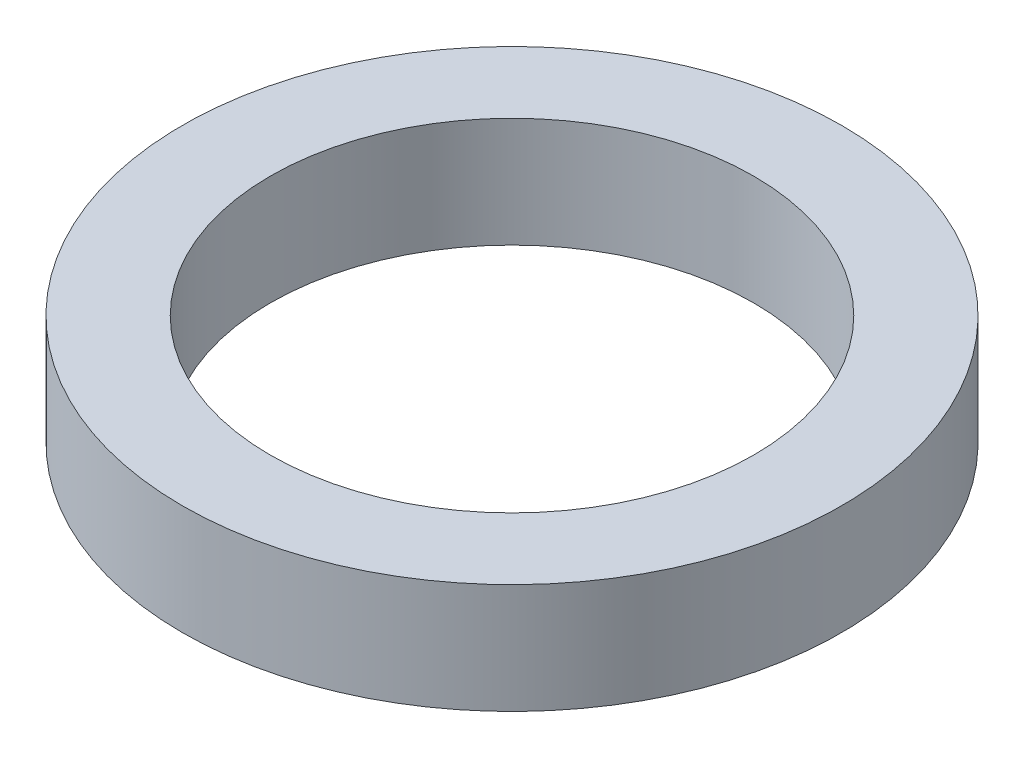
ISO-10303-21;
HEADER;
FILE_DESCRIPTION(('STEP AP214'),'2;1');
FILE_NAME('part.step','',(''),(''),'','','');
FILE_SCHEMA(('AUTOMOTIVE_DESIGN { 1 0 10303 214 1 1 1 1 }'));
ENDSEC;
DATA;
#1=APPLICATION_CONTEXT('core data for automotive mechanical design processes');
#2=APPLICATION_PROTOCOL_DEFINITION('international standard','automotive_design',2000,#1);
#3=PRODUCT_CONTEXT('',#1,'mechanical');
#4=PRODUCT('Part','Part','',(#3));
#5=PRODUCT_RELATED_PRODUCT_CATEGORY('part','',(#4));
#6=PRODUCT_DEFINITION_FORMATION('','',#4);
#7=PRODUCT_DEFINITION_CONTEXT('part definition',#1,'design');
#8=PRODUCT_DEFINITION('design','',#6,#7);
#9=PRODUCT_DEFINITION_SHAPE('','',#8);
#10=(LENGTH_UNIT() NAMED_UNIT(*) SI_UNIT(.MILLI.,.METRE.));
#11=(NAMED_UNIT(*) PLANE_ANGLE_UNIT() SI_UNIT($,.RADIAN.));
#12=(NAMED_UNIT(*) SI_UNIT($,.STERADIAN.) SOLID_ANGLE_UNIT());
#13=UNCERTAINTY_MEASURE_WITH_UNIT(LENGTH_MEASURE(1.E-05),#10,'distance_accuracy_value','');
#14=(GEOMETRIC_REPRESENTATION_CONTEXT(3) GLOBAL_UNCERTAINTY_ASSIGNED_CONTEXT((#13)) GLOBAL_UNIT_ASSIGNED_CONTEXT((#10,
#11,#12)) REPRESENTATION_CONTEXT('',''));
#15=CARTESIAN_POINT('',(0.,0.,0.));
#16=DIRECTION('',(0.,0.,1.));
#17=DIRECTION('',(1.,0.,0.));
#18=AXIS2_PLACEMENT_3D('',#15,#16,#17);
#19=CARTESIAN_POINT('',(0.,5.,0.));
#20=DIRECTION('',(0.,1.,0.));
#21=DIRECTION('',(0.,0.,1.));
#22=AXIS2_PLACEMENT_3D('',#19,#20,#21);
#23=PLANE('',#22);
#24=CARTESIAN_POINT('',(0.,5.,0.));
#25=DIRECTION('',(0.,1.,0.));
#26=DIRECTION('',(0.,0.,1.));
#27=AXIS2_PLACEMENT_3D('',#24,#25,#26);
#28=CIRCLE('',#27,15.);
#29=CARTESIAN_POINT('',(0.,5.,15.));
#30=VERTEX_POINT('',#29);
#31=EDGE_CURVE('E10',#30,#30,#28,.T.);
#32=ORIENTED_EDGE('',*,*,#31,.T.);
#33=EDGE_LOOP('',(#32));
#34=FACE_BOUND('',#33,.T.);
#35=CARTESIAN_POINT('',(0.,5.,0.));
#36=DIRECTION('',(0.,1.,0.));
#37=DIRECTION('',(0.,0.,1.));
#38=AXIS2_PLACEMENT_3D('',#35,#36,#37);
#39=CIRCLE('',#38,11.);
#40=CARTESIAN_POINT('',(0.,5.,11.));
#41=VERTEX_POINT('',#40);
#42=EDGE_CURVE('E50',#41,#41,#39,.T.);
#43=ORIENTED_EDGE('',*,*,#42,.F.);
#44=EDGE_LOOP('',(#43));
#45=FACE_BOUND('',#44,.T.);
#46=ADVANCED_FACE('F39',(#34,#45),#23,.T.);
#47=CARTESIAN_POINT('',(0.,0.,0.));
#48=DIRECTION('',(0.,1.,0.));
#49=DIRECTION('',(0.,0.,1.));
#50=AXIS2_PLACEMENT_3D('',#47,#48,#49);
#51=PLANE('',#50);
#52=CARTESIAN_POINT('',(0.,0.,0.));
#53=DIRECTION('',(0.,1.,0.));
#54=DIRECTION('',(0.,0.,1.));
#55=AXIS2_PLACEMENT_3D('',#52,#53,#54);
#56=CIRCLE('',#55,15.);
#57=CARTESIAN_POINT('',(0.,0.,15.));
#58=VERTEX_POINT('',#57);
#59=EDGE_CURVE('E43',#58,#58,#56,.T.);
#60=ORIENTED_EDGE('',*,*,#59,.F.);
#61=EDGE_LOOP('',(#60));
#62=FACE_BOUND('',#61,.T.);
#63=CARTESIAN_POINT('',(0.,0.,0.));
#64=DIRECTION('',(0.,1.,0.));
#65=DIRECTION('',(0.,0.,1.));
#66=AXIS2_PLACEMENT_3D('',#63,#64,#65);
#67=CIRCLE('',#66,11.);
#68=CARTESIAN_POINT('',(0.,0.,11.));
#69=VERTEX_POINT('',#68);
#70=EDGE_CURVE('E52',#69,#69,#67,.T.);
#71=ORIENTED_EDGE('',*,*,#70,.T.);
#72=EDGE_LOOP('',(#71));
#73=FACE_BOUND('',#72,.T.);
#74=ADVANCED_FACE('F62',(#62,#73),#51,.F.);
#75=CARTESIAN_POINT('',(0.,5.,0.));
#76=DIRECTION('',(0.,-1.,0.));
#77=DIRECTION('',(0.,0.,-1.));
#78=AXIS2_PLACEMENT_3D('',#75,#76,#77);
#79=CYLINDRICAL_SURFACE('',#78,15.);
#80=ORIENTED_EDGE('',*,*,#31,.F.);
#81=EDGE_LOOP('',(#80));
#82=FACE_BOUND('',#81,.T.);
#83=ORIENTED_EDGE('',*,*,#59,.T.);
#84=EDGE_LOOP('',(#83));
#85=FACE_BOUND('',#84,.T.);
#86=ADVANCED_FACE('F41',(#82,#85),#79,.T.);
#87=CARTESIAN_POINT('',(0.,5.,0.));
#88=DIRECTION('',(0.,-1.,0.));
#89=DIRECTION('',(0.,0.,-1.));
#90=AXIS2_PLACEMENT_3D('',#87,#88,#89);
#91=CYLINDRICAL_SURFACE('',#90,11.);
#92=ORIENTED_EDGE('',*,*,#42,.T.);
#93=EDGE_LOOP('',(#92));
#94=FACE_BOUND('',#93,.T.);
#95=ORIENTED_EDGE('',*,*,#70,.F.);
#96=EDGE_LOOP('',(#95));
#97=FACE_BOUND('',#96,.T.);
#98=ADVANCED_FACE('F58',(#94,#97),#91,.F.);
#99=CLOSED_SHELL('',(#46,#74,#86,#98));
#100=MANIFOLD_SOLID_BREP('B2',#99);
#101=ADVANCED_BREP_SHAPE_REPRESENTATION('',(#18,#100),#14);
#102=SHAPE_DEFINITION_REPRESENTATION(#9,#101);
ENDSEC;
END-ISO-10303-21;
